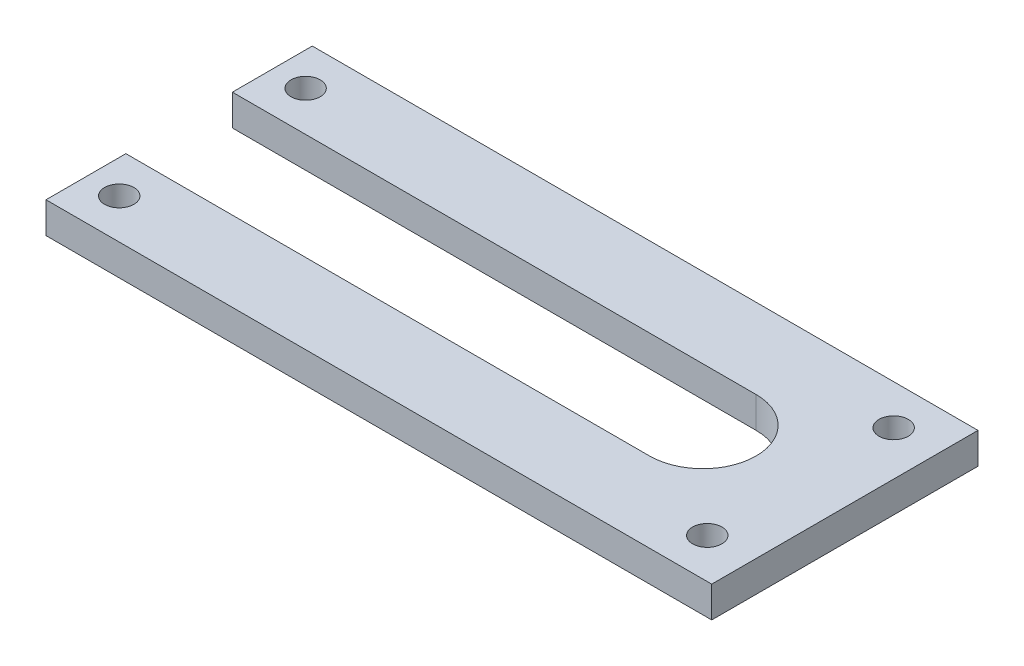
ISO-10303-21;
HEADER;
FILE_DESCRIPTION(('STEP AP214'),'2;1');
FILE_NAME('part.step','',(''),(''),'','','');
FILE_SCHEMA(('AUTOMOTIVE_DESIGN { 1 0 10303 214 1 1 1 1 }'));
ENDSEC;
DATA;
#1=APPLICATION_CONTEXT('core data for automotive mechanical design processes');
#2=APPLICATION_PROTOCOL_DEFINITION('international standard','automotive_design',2000,#1);
#3=PRODUCT_CONTEXT('',#1,'mechanical');
#4=PRODUCT('Part','Part','',(#3));
#5=PRODUCT_RELATED_PRODUCT_CATEGORY('part','',(#4));
#6=PRODUCT_DEFINITION_FORMATION('','',#4);
#7=PRODUCT_DEFINITION_CONTEXT('part definition',#1,'design');
#8=PRODUCT_DEFINITION('design','',#6,#7);
#9=PRODUCT_DEFINITION_SHAPE('','',#8);
#10=(LENGTH_UNIT() NAMED_UNIT(*) SI_UNIT(.MILLI.,.METRE.));
#11=(NAMED_UNIT(*) PLANE_ANGLE_UNIT() SI_UNIT($,.RADIAN.));
#12=(NAMED_UNIT(*) SI_UNIT($,.STERADIAN.) SOLID_ANGLE_UNIT());
#13=UNCERTAINTY_MEASURE_WITH_UNIT(LENGTH_MEASURE(1.E-05),#10,'distance_accuracy_value','');
#14=(GEOMETRIC_REPRESENTATION_CONTEXT(3) GLOBAL_UNCERTAINTY_ASSIGNED_CONTEXT((#13)) GLOBAL_UNIT_ASSIGNED_CONTEXT((#10,
#11,#12)) REPRESENTATION_CONTEXT('',''));
#15=CARTESIAN_POINT('',(0.,0.,0.));
#16=DIRECTION('',(0.,0.,1.));
#17=DIRECTION('',(1.,0.,0.));
#18=AXIS2_PLACEMENT_3D('',#15,#16,#17);
#19=CARTESIAN_POINT('',(0.,6.99999999999998,-80.));
#20=DIRECTION('',(-1.,0.,0.));
#21=DIRECTION('',(0.,-1.,0.));
#22=AXIS2_PLACEMENT_3D('',#19,#20,#21);
#23=PLANE('',#22);
#24=DIRECTION('',(0.,0.,1.));
#25=VECTOR('',#24,1.);
#26=CARTESIAN_POINT('',(0.,6.99999999999998,-80.));
#27=LINE('',#26,#25);
#28=CARTESIAN_POINT('',(0.,7.,-18.));
#29=VERTEX_POINT('',#28);
#30=CARTESIAN_POINT('',(0.,6.99999999999998,0.));
#31=VERTEX_POINT('',#30);
#32=EDGE_CURVE('E101',#29,#31,#27,.T.);
#33=ORIENTED_EDGE('',*,*,#32,.F.);
#34=DIRECTION('',(0.,-1.,0.));
#35=VECTOR('',#34,1.);
#36=CARTESIAN_POINT('',(0.,7.,-18.));
#37=LINE('',#36,#35);
#38=CARTESIAN_POINT('',(0.,0.,-18.));
#39=VERTEX_POINT('',#38);
#40=EDGE_CURVE('E166',#29,#39,#37,.T.);
#41=ORIENTED_EDGE('',*,*,#40,.T.);
#42=DIRECTION('',(0.,0.,1.));
#43=VECTOR('',#42,1.);
#44=CARTESIAN_POINT('',(0.,0.,-80.));
#45=LINE('',#44,#43);
#46=CARTESIAN_POINT('',(0.,0.,0.));
#47=VERTEX_POINT('',#46);
#48=EDGE_CURVE('E96',#39,#47,#45,.T.);
#49=ORIENTED_EDGE('',*,*,#48,.T.);
#50=DIRECTION('',(0.,-1.,0.));
#51=VECTOR('',#50,1.);
#52=CARTESIAN_POINT('',(0.,6.99999999999998,0.));
#53=LINE('',#52,#51);
#54=EDGE_CURVE('E178',#31,#47,#53,.T.);
#55=ORIENTED_EDGE('',*,*,#54,.F.);
#56=EDGE_LOOP('',(#33,#41,#49,#55));
#57=FACE_BOUND('',#56,.T.);
#58=ADVANCED_FACE('F93',(#57),#23,.T.);
#59=DIRECTION('',(0.,-1.,0.));
#60=VECTOR('',#59,1.);
#61=CARTESIAN_POINT('',(0.,7.,-42.));
#62=LINE('',#61,#60);
#63=CARTESIAN_POINT('',(0.,7.,-42.));
#64=VERTEX_POINT('',#63);
#65=CARTESIAN_POINT('',(0.,0.,-42.));
#66=VERTEX_POINT('',#65);
#67=EDGE_CURVE('E117',#64,#66,#62,.T.);
#68=ORIENTED_EDGE('',*,*,#67,.F.);
#69=CARTESIAN_POINT('',(0.,7.,-60.));
#70=VERTEX_POINT('',#69);
#71=EDGE_CURVE('E12',#70,#64,#27,.T.);
#72=ORIENTED_EDGE('',*,*,#71,.F.);
#73=DIRECTION('',(0.,-1.,0.));
#74=VECTOR('',#73,1.);
#75=CARTESIAN_POINT('',(0.,7.,-60.));
#76=LINE('',#75,#74);
#77=CARTESIAN_POINT('',(0.,0.,-60.));
#78=VERTEX_POINT('',#77);
#79=EDGE_CURVE('E200',#70,#78,#76,.T.);
#80=ORIENTED_EDGE('',*,*,#79,.T.);
#81=EDGE_CURVE('E218',#78,#66,#45,.T.);
#82=ORIENTED_EDGE('',*,*,#81,.T.);
#83=EDGE_LOOP('',(#68,#72,#80,#82));
#84=FACE_BOUND('',#83,.T.);
#85=ADVANCED_FACE('F246',(#84),#23,.T.);
#86=CARTESIAN_POINT('',(150.,7.,-80.));
#87=DIRECTION('',(0.,1.,0.));
#88=DIRECTION('',(-1.,0.,0.));
#89=AXIS2_PLACEMENT_3D('',#86,#87,#88);
#90=PLANE('',#89);
#91=CARTESIAN_POINT('',(140.,7.,-51.));
#92=DIRECTION('',(0.,1.,0.));
#93=DIRECTION('',(0.,0.,1.));
#94=AXIS2_PLACEMENT_3D('',#91,#92,#93);
#95=CIRCLE('',#94,3.3);
#96=CARTESIAN_POINT('',(140.,7.,-47.7));
#97=VERTEX_POINT('',#96);
#98=EDGE_CURVE('E346',#97,#97,#95,.T.);
#99=ORIENTED_EDGE('',*,*,#98,.F.);
#100=EDGE_LOOP('',(#99));
#101=FACE_BOUND('',#100,.T.);
#102=CARTESIAN_POINT('',(140.,7.,-9.00000000000008));
#103=DIRECTION('',(0.,-1.,0.));
#104=DIRECTION('',(0.,0.,-1.));
#105=AXIS2_PLACEMENT_3D('',#102,#103,#104);
#106=CIRCLE('',#105,3.3);
#107=CARTESIAN_POINT('',(140.,7.,-12.3000000000001));
#108=VERTEX_POINT('',#107);
#109=EDGE_CURVE('E352',#108,#108,#106,.T.);
#110=ORIENTED_EDGE('',*,*,#109,.T.);
#111=EDGE_LOOP('',(#110));
#112=FACE_BOUND('',#111,.T.);
#113=CARTESIAN_POINT('',(118.,7.,-30.));
#114=DIRECTION('',(0.,1.,0.));
#115=DIRECTION('',(0.,0.,1.));
#116=AXIS2_PLACEMENT_3D('',#113,#114,#115);
#117=CIRCLE('',#116,12.);
#118=CARTESIAN_POINT('',(118.,7.,-18.));
#119=VERTEX_POINT('',#118);
#120=CARTESIAN_POINT('',(118.,7.,-42.));
#121=VERTEX_POINT('',#120);
#122=EDGE_CURVE('E170',#119,#121,#117,.T.);
#123=ORIENTED_EDGE('',*,*,#122,.F.);
#124=DIRECTION('',(1.,0.,0.));
#125=VECTOR('',#124,1.);
#126=CARTESIAN_POINT('',(0.,7.,-18.));
#127=LINE('',#126,#125);
#128=EDGE_CURVE('E160',#29,#119,#127,.T.);
#129=ORIENTED_EDGE('',*,*,#128,.F.);
#130=ORIENTED_EDGE('',*,*,#32,.T.);
#131=DIRECTION('',(-1.,0.,0.));
#132=VECTOR('',#131,1.);
#133=CARTESIAN_POINT('',(150.,7.,0.));
#134=LINE('',#133,#132);
#135=CARTESIAN_POINT('',(150.,7.,0.));
#136=VERTEX_POINT('',#135);
#137=EDGE_CURVE('E213',#136,#31,#134,.T.);
#138=ORIENTED_EDGE('',*,*,#137,.F.);
#139=DIRECTION('',(0.,0.,1.));
#140=VECTOR('',#139,1.);
#141=CARTESIAN_POINT('',(150.,7.,-80.));
#142=LINE('',#141,#140);
#143=CARTESIAN_POINT('',(150.,7.,-60.));
#144=VERTEX_POINT('',#143);
#145=EDGE_CURVE('E216',#144,#136,#142,.T.);
#146=ORIENTED_EDGE('',*,*,#145,.F.);
#147=DIRECTION('',(1.,0.,0.));
#148=VECTOR('',#147,1.);
#149=CARTESIAN_POINT('',(0.,7.,-60.));
#150=LINE('',#149,#148);
#151=EDGE_CURVE('E186',#70,#144,#150,.T.);
#152=ORIENTED_EDGE('',*,*,#151,.F.);
#153=ORIENTED_EDGE('',*,*,#71,.T.);
#154=DIRECTION('',(1.,0.,0.));
#155=VECTOR('',#154,1.);
#156=CARTESIAN_POINT('',(0.,7.,-42.));
#157=LINE('',#156,#155);
#158=EDGE_CURVE('E184',#64,#121,#157,.T.);
#159=ORIENTED_EDGE('',*,*,#158,.T.);
#160=EDGE_LOOP('',(#123,#129,#130,#138,#146,#152,#153,#159));
#161=FACE_BOUND('',#160,.T.);
#162=CARTESIAN_POINT('',(7.5,7.,-9.00000000000001));
#163=DIRECTION('',(0.,-1.,0.));
#164=DIRECTION('',(0.,0.,-1.));
#165=AXIS2_PLACEMENT_3D('',#162,#163,#164);
#166=CIRCLE('',#165,3.3);
#167=CARTESIAN_POINT('',(7.5,7.,-12.3));
#168=VERTEX_POINT('',#167);
#169=EDGE_CURVE('E338',#168,#168,#166,.T.);
#170=ORIENTED_EDGE('',*,*,#169,.T.);
#171=EDGE_LOOP('',(#170));
#172=FACE_BOUND('',#171,.T.);
#173=CARTESIAN_POINT('',(7.5,7.,-51.));
#174=DIRECTION('',(0.,1.,0.));
#175=DIRECTION('',(0.,0.,1.));
#176=AXIS2_PLACEMENT_3D('',#173,#174,#175);
#177=CIRCLE('',#176,3.3);
#178=CARTESIAN_POINT('',(7.5,7.,-47.7));
#179=VERTEX_POINT('',#178);
#180=EDGE_CURVE('E333',#179,#179,#177,.T.);
#181=ORIENTED_EDGE('',*,*,#180,.F.);
#182=EDGE_LOOP('',(#181));
#183=FACE_BOUND('',#182,.T.);
#184=ADVANCED_FACE('F182',(#101,#112,#161,#172,#183),#90,.T.);
#185=CARTESIAN_POINT('',(150.,0.,-80.));
#186=DIRECTION('',(1.,0.,0.));
#187=DIRECTION('',(0.,1.,0.));
#188=AXIS2_PLACEMENT_3D('',#185,#186,#187);
#189=PLANE('',#188);
#190=DIRECTION('',(0.,0.,1.));
#191=VECTOR('',#190,1.);
#192=CARTESIAN_POINT('',(150.,0.,-80.));
#193=LINE('',#192,#191);
#194=CARTESIAN_POINT('',(150.,0.,-60.));
#195=VERTEX_POINT('',#194);
#196=CARTESIAN_POINT('',(150.,0.,0.));
#197=VERTEX_POINT('',#196);
#198=EDGE_CURVE('E217',#195,#197,#193,.T.);
#199=ORIENTED_EDGE('',*,*,#198,.F.);
#200=DIRECTION('',(0.,-1.,0.));
#201=VECTOR('',#200,1.);
#202=CARTESIAN_POINT('',(150.,7.,-60.));
#203=LINE('',#202,#201);
#204=EDGE_CURVE('E109',#144,#195,#203,.T.);
#205=ORIENTED_EDGE('',*,*,#204,.F.);
#206=ORIENTED_EDGE('',*,*,#145,.T.);
#207=DIRECTION('',(0.,1.,0.));
#208=VECTOR('',#207,1.);
#209=CARTESIAN_POINT('',(150.,0.,0.));
#210=LINE('',#209,#208);
#211=EDGE_CURVE('E210',#197,#136,#210,.T.);
#212=ORIENTED_EDGE('',*,*,#211,.F.);
#213=EDGE_LOOP('',(#199,#205,#206,#212));
#214=FACE_BOUND('',#213,.T.);
#215=ADVANCED_FACE('F238',(#214),#189,.T.);
#216=CARTESIAN_POINT('',(0.,0.,-80.));
#217=DIRECTION('',(0.,-1.,0.));
#218=DIRECTION('',(0.,0.,-1.));
#219=AXIS2_PLACEMENT_3D('',#216,#217,#218);
#220=PLANE('',#219);
#221=CARTESIAN_POINT('',(140.,0.,-51.));
#222=DIRECTION('',(0.,1.,0.));
#223=DIRECTION('',(0.,0.,1.));
#224=AXIS2_PLACEMENT_3D('',#221,#222,#223);
#225=CIRCLE('',#224,3.3);
#226=CARTESIAN_POINT('',(140.,0.,-47.7));
#227=VERTEX_POINT('',#226);
#228=EDGE_CURVE('E349',#227,#227,#225,.T.);
#229=ORIENTED_EDGE('',*,*,#228,.T.);
#230=EDGE_LOOP('',(#229));
#231=FACE_BOUND('',#230,.T.);
#232=CARTESIAN_POINT('',(140.,0.,-9.00000000000008));
#233=DIRECTION('',(0.,-1.,0.));
#234=DIRECTION('',(0.,0.,-1.));
#235=AXIS2_PLACEMENT_3D('',#232,#233,#234);
#236=CIRCLE('',#235,3.3);
#237=CARTESIAN_POINT('',(140.,0.,-12.3000000000001));
#238=VERTEX_POINT('',#237);
#239=EDGE_CURVE('E193',#238,#238,#236,.T.);
#240=ORIENTED_EDGE('',*,*,#239,.F.);
#241=EDGE_LOOP('',(#240));
#242=FACE_BOUND('',#241,.T.);
#243=ORIENTED_EDGE('',*,*,#48,.F.);
#244=DIRECTION('',(1.,0.,0.));
#245=VECTOR('',#244,1.);
#246=CARTESIAN_POINT('',(0.,0.,-18.));
#247=LINE('',#246,#245);
#248=CARTESIAN_POINT('',(118.,0.,-18.));
#249=VERTEX_POINT('',#248);
#250=EDGE_CURVE('E191',#39,#249,#247,.T.);
#251=ORIENTED_EDGE('',*,*,#250,.T.);
#252=CARTESIAN_POINT('',(118.,0.,-30.));
#253=DIRECTION('',(0.,1.,0.));
#254=DIRECTION('',(0.,0.,1.));
#255=AXIS2_PLACEMENT_3D('',#252,#253,#254);
#256=CIRCLE('',#255,12.);
#257=CARTESIAN_POINT('',(118.,0.,-42.));
#258=VERTEX_POINT('',#257);
#259=EDGE_CURVE('E177',#249,#258,#256,.T.);
#260=ORIENTED_EDGE('',*,*,#259,.T.);
#261=DIRECTION('',(1.,0.,0.));
#262=VECTOR('',#261,1.);
#263=CARTESIAN_POINT('',(0.,0.,-42.));
#264=LINE('',#263,#262);
#265=EDGE_CURVE('E195',#66,#258,#264,.T.);
#266=ORIENTED_EDGE('',*,*,#265,.F.);
#267=ORIENTED_EDGE('',*,*,#81,.F.);
#268=DIRECTION('',(1.,0.,0.));
#269=VECTOR('',#268,1.);
#270=CARTESIAN_POINT('',(0.,0.,-60.));
#271=LINE('',#270,#269);
#272=EDGE_CURVE('E171',#78,#195,#271,.T.);
#273=ORIENTED_EDGE('',*,*,#272,.T.);
#274=ORIENTED_EDGE('',*,*,#198,.T.);
#275=DIRECTION('',(1.,0.,0.));
#276=VECTOR('',#275,1.);
#277=CARTESIAN_POINT('',(0.,0.,0.));
#278=LINE('',#277,#276);
#279=EDGE_CURVE('E207',#47,#197,#278,.T.);
#280=ORIENTED_EDGE('',*,*,#279,.F.);
#281=EDGE_LOOP('',(#243,#251,#260,#266,#267,#273,#274,#280));
#282=FACE_BOUND('',#281,.T.);
#283=CARTESIAN_POINT('',(7.5,0.,-9.00000000000001));
#284=DIRECTION('',(0.,-1.,0.));
#285=DIRECTION('',(0.,0.,-1.));
#286=AXIS2_PLACEMENT_3D('',#283,#284,#285);
#287=CIRCLE('',#286,3.3);
#288=CARTESIAN_POINT('',(7.5,0.,-12.3));
#289=VERTEX_POINT('',#288);
#290=EDGE_CURVE('E341',#289,#289,#287,.T.);
#291=ORIENTED_EDGE('',*,*,#290,.F.);
#292=EDGE_LOOP('',(#291));
#293=FACE_BOUND('',#292,.T.);
#294=CARTESIAN_POINT('',(7.5,0.,-51.));
#295=DIRECTION('',(0.,1.,0.));
#296=DIRECTION('',(0.,0.,1.));
#297=AXIS2_PLACEMENT_3D('',#294,#295,#296);
#298=CIRCLE('',#297,3.3);
#299=CARTESIAN_POINT('',(7.5,0.,-47.7));
#300=VERTEX_POINT('',#299);
#301=EDGE_CURVE('E336',#300,#300,#298,.T.);
#302=ORIENTED_EDGE('',*,*,#301,.T.);
#303=EDGE_LOOP('',(#302));
#304=FACE_BOUND('',#303,.T.);
#305=ADVANCED_FACE('F229',(#231,#242,#282,#293,#304),#220,.T.);
#306=CARTESIAN_POINT('',(0.,0.,0.));
#307=DIRECTION('',(0.,0.,1.));
#308=DIRECTION('',(1.,0.,0.));
#309=AXIS2_PLACEMENT_3D('',#306,#307,#308);
#310=PLANE('',#309);
#311=ORIENTED_EDGE('',*,*,#54,.T.);
#312=ORIENTED_EDGE('',*,*,#279,.T.);
#313=ORIENTED_EDGE('',*,*,#211,.T.);
#314=ORIENTED_EDGE('',*,*,#137,.T.);
#315=EDGE_LOOP('',(#311,#312,#313,#314));
#316=FACE_BOUND('',#315,.T.);
#317=ADVANCED_FACE('F232',(#316),#310,.T.);
#318=CARTESIAN_POINT('',(0.,7.,-60.));
#319=DIRECTION('',(0.,0.,-1.));
#320=DIRECTION('',(-1.,0.,0.));
#321=AXIS2_PLACEMENT_3D('',#318,#319,#320);
#322=PLANE('',#321);
#323=ORIENTED_EDGE('',*,*,#272,.F.);
#324=ORIENTED_EDGE('',*,*,#79,.F.);
#325=ORIENTED_EDGE('',*,*,#151,.T.);
#326=ORIENTED_EDGE('',*,*,#204,.T.);
#327=EDGE_LOOP('',(#323,#324,#325,#326));
#328=FACE_BOUND('',#327,.T.);
#329=ADVANCED_FACE('F268',(#328),#322,.T.);
#330=CARTESIAN_POINT('',(0.,7.,-18.));
#331=DIRECTION('',(0.,0.,-1.));
#332=DIRECTION('',(-1.,0.,0.));
#333=AXIS2_PLACEMENT_3D('',#330,#331,#332);
#334=PLANE('',#333);
#335=ORIENTED_EDGE('',*,*,#250,.F.);
#336=ORIENTED_EDGE('',*,*,#40,.F.);
#337=ORIENTED_EDGE('',*,*,#128,.T.);
#338=DIRECTION('',(0.,-1.,0.));
#339=VECTOR('',#338,1.);
#340=CARTESIAN_POINT('',(118.,7.,-18.));
#341=LINE('',#340,#339);
#342=EDGE_CURVE('E163',#119,#249,#341,.T.);
#343=ORIENTED_EDGE('',*,*,#342,.T.);
#344=EDGE_LOOP('',(#335,#336,#337,#343));
#345=FACE_BOUND('',#344,.T.);
#346=ADVANCED_FACE('F162',(#345),#334,.T.);
#347=CARTESIAN_POINT('',(118.,7.,-30.));
#348=DIRECTION('',(0.,-1.,0.));
#349=DIRECTION('',(0.,0.,-1.));
#350=AXIS2_PLACEMENT_3D('',#347,#348,#349);
#351=CYLINDRICAL_SURFACE('',#350,12.);
#352=ORIENTED_EDGE('',*,*,#259,.F.);
#353=ORIENTED_EDGE('',*,*,#342,.F.);
#354=ORIENTED_EDGE('',*,*,#122,.T.);
#355=DIRECTION('',(0.,-1.,0.));
#356=VECTOR('',#355,1.);
#357=CARTESIAN_POINT('',(118.,7.,-42.));
#358=LINE('',#357,#356);
#359=EDGE_CURVE('E179',#121,#258,#358,.T.);
#360=ORIENTED_EDGE('',*,*,#359,.T.);
#361=EDGE_LOOP('',(#352,#353,#354,#360));
#362=FACE_BOUND('',#361,.T.);
#363=ADVANCED_FACE('F174',(#362),#351,.F.);
#364=CARTESIAN_POINT('',(0.,7.,-42.));
#365=DIRECTION('',(0.,0.,-1.));
#366=DIRECTION('',(-1.,0.,0.));
#367=AXIS2_PLACEMENT_3D('',#364,#365,#366);
#368=PLANE('',#367);
#369=ORIENTED_EDGE('',*,*,#265,.T.);
#370=ORIENTED_EDGE('',*,*,#359,.F.);
#371=ORIENTED_EDGE('',*,*,#158,.F.);
#372=ORIENTED_EDGE('',*,*,#67,.T.);
#373=EDGE_LOOP('',(#369,#370,#371,#372));
#374=FACE_BOUND('',#373,.T.);
#375=ADVANCED_FACE('F255',(#374),#368,.F.);
#376=CARTESIAN_POINT('',(140.,7.,-9.00000000000008));
#377=DIRECTION('',(0.,-1.,0.));
#378=DIRECTION('',(0.,0.,-1.));
#379=AXIS2_PLACEMENT_3D('',#376,#377,#378);
#380=CYLINDRICAL_SURFACE('',#379,3.3);
#381=ORIENTED_EDGE('',*,*,#109,.F.);
#382=EDGE_LOOP('',(#381));
#383=FACE_BOUND('',#382,.T.);
#384=ORIENTED_EDGE('',*,*,#239,.T.);
#385=EDGE_LOOP('',(#384));
#386=FACE_BOUND('',#385,.T.);
#387=ADVANCED_FACE('F257',(#383,#386),#380,.F.);
#388=CARTESIAN_POINT('',(140.,7.,-51.));
#389=DIRECTION('',(0.,-1.,0.));
#390=DIRECTION('',(0.,0.,-1.));
#391=AXIS2_PLACEMENT_3D('',#388,#389,#390);
#392=CYLINDRICAL_SURFACE('',#391,3.3);
#393=ORIENTED_EDGE('',*,*,#98,.T.);
#394=EDGE_LOOP('',(#393));
#395=FACE_BOUND('',#394,.T.);
#396=ORIENTED_EDGE('',*,*,#228,.F.);
#397=EDGE_LOOP('',(#396));
#398=FACE_BOUND('',#397,.T.);
#399=ADVANCED_FACE('F263',(#395,#398),#392,.F.);
#400=CARTESIAN_POINT('',(7.5,7.,-9.00000000000001));
#401=DIRECTION('',(0.,-1.,0.));
#402=DIRECTION('',(0.,0.,-1.));
#403=AXIS2_PLACEMENT_3D('',#400,#401,#402);
#404=CYLINDRICAL_SURFACE('',#403,3.3);
#405=ORIENTED_EDGE('',*,*,#169,.F.);
#406=EDGE_LOOP('',(#405));
#407=FACE_BOUND('',#406,.T.);
#408=ORIENTED_EDGE('',*,*,#290,.T.);
#409=EDGE_LOOP('',(#408));
#410=FACE_BOUND('',#409,.T.);
#411=ADVANCED_FACE('F307',(#407,#410),#404,.F.);
#412=CARTESIAN_POINT('',(7.5,7.,-51.));
#413=DIRECTION('',(0.,-1.,0.));
#414=DIRECTION('',(0.,0.,-1.));
#415=AXIS2_PLACEMENT_3D('',#412,#413,#414);
#416=CYLINDRICAL_SURFACE('',#415,3.3);
#417=ORIENTED_EDGE('',*,*,#180,.T.);
#418=EDGE_LOOP('',(#417));
#419=FACE_BOUND('',#418,.T.);
#420=ORIENTED_EDGE('',*,*,#301,.F.);
#421=EDGE_LOOP('',(#420));
#422=FACE_BOUND('',#421,.T.);
#423=ADVANCED_FACE('F317',(#419,#422),#416,.F.);
#424=CLOSED_SHELL('',(#58,#85,#184,#215,#305,#317,#329,#346,#363,#375,#387,#399,#411,#423));
#425=MANIFOLD_SOLID_BREP('B2',#424);
#426=ADVANCED_BREP_SHAPE_REPRESENTATION('',(#18,#425),#14);
#427=SHAPE_DEFINITION_REPRESENTATION(#9,#426);
ENDSEC;
END-ISO-10303-21;
